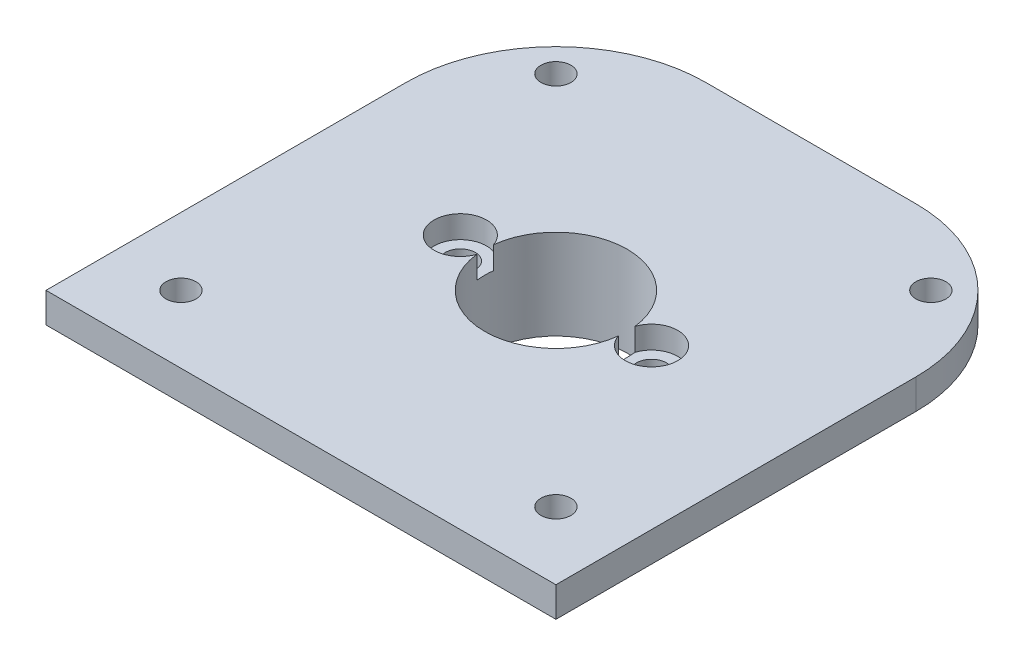
ISO-10303-21;
HEADER;
FILE_DESCRIPTION(('STEP AP214'),'2;1');
FILE_NAME('part.step','',(''),(''),'','','');
FILE_SCHEMA(('AUTOMOTIVE_DESIGN { 1 0 10303 214 1 1 1 1 }'));
ENDSEC;
DATA;
#1=APPLICATION_CONTEXT('core data for automotive mechanical design processes');
#2=APPLICATION_PROTOCOL_DEFINITION('international standard','automotive_design',2000,#1);
#3=PRODUCT_CONTEXT('',#1,'mechanical');
#4=PRODUCT('Part','Part','',(#3));
#5=PRODUCT_RELATED_PRODUCT_CATEGORY('part','',(#4));
#6=PRODUCT_DEFINITION_FORMATION('','',#4);
#7=PRODUCT_DEFINITION_CONTEXT('part definition',#1,'design');
#8=PRODUCT_DEFINITION('design','',#6,#7);
#9=PRODUCT_DEFINITION_SHAPE('','',#8);
#10=(LENGTH_UNIT() NAMED_UNIT(*) SI_UNIT(.MILLI.,.METRE.));
#11=(NAMED_UNIT(*) PLANE_ANGLE_UNIT() SI_UNIT($,.RADIAN.));
#12=(NAMED_UNIT(*) SI_UNIT($,.STERADIAN.) SOLID_ANGLE_UNIT());
#13=UNCERTAINTY_MEASURE_WITH_UNIT(LENGTH_MEASURE(1.E-05),#10,'distance_accuracy_value','');
#14=(GEOMETRIC_REPRESENTATION_CONTEXT(3) GLOBAL_UNCERTAINTY_ASSIGNED_CONTEXT((#13)) GLOBAL_UNIT_ASSIGNED_CONTEXT((#10,
#11,#12)) REPRESENTATION_CONTEXT('',''));
#15=CARTESIAN_POINT('',(0.,0.,0.));
#16=DIRECTION('',(0.,0.,1.));
#17=DIRECTION('',(1.,0.,0.));
#18=AXIS2_PLACEMENT_3D('',#15,#16,#17);
#19=CARTESIAN_POINT('',(21.25,4.,-34.));
#20=DIRECTION('',(0.,-1.,0.));
#21=DIRECTION('',(0.,0.,-1.));
#22=AXIS2_PLACEMENT_3D('',#19,#20,#21);
#23=CYLINDRICAL_SURFACE('',#22,2.);
#24=CARTESIAN_POINT('',(21.25,-8.,-34.));
#25=DIRECTION('',(0.,-1.,0.));
#26=DIRECTION('',(0.,0.,-1.));
#27=AXIS2_PLACEMENT_3D('',#24,#25,#26);
#28=CIRCLE('',#27,2.);
#29=CARTESIAN_POINT('',(21.25,-8.,-36.));
#30=VERTEX_POINT('',#29);
#31=EDGE_CURVE('E498',#30,#30,#28,.T.);
#32=ORIENTED_EDGE('',*,*,#31,.T.);
#33=EDGE_LOOP('',(#32));
#34=FACE_BOUND('',#33,.T.);
#35=CARTESIAN_POINT('',(21.25,1.,-34.));
#36=DIRECTION('',(0.,1.,0.));
#37=DIRECTION('',(0.,0.,1.));
#38=AXIS2_PLACEMENT_3D('',#35,#36,#37);
#39=CIRCLE('',#38,2.);
#40=CARTESIAN_POINT('',(21.25,1.,-32.));
#41=VERTEX_POINT('',#40);
#42=EDGE_CURVE('E481',#41,#41,#39,.T.);
#43=ORIENTED_EDGE('',*,*,#42,.T.);
#44=EDGE_LOOP('',(#43));
#45=FACE_BOUND('',#44,.T.);
#46=ADVANCED_FACE('F39',(#34,#45),#23,.F.);
#47=CARTESIAN_POINT('',(46.75,4.,-34.));
#48=DIRECTION('',(0.,-1.,0.));
#49=DIRECTION('',(0.,0.,-1.));
#50=AXIS2_PLACEMENT_3D('',#47,#48,#49);
#51=CYLINDRICAL_SURFACE('',#50,2.);
#52=CARTESIAN_POINT('',(46.75,-8.,-34.));
#53=DIRECTION('',(0.,-1.,0.));
#54=DIRECTION('',(0.,0.,-1.));
#55=AXIS2_PLACEMENT_3D('',#52,#53,#54);
#56=CIRCLE('',#55,2.);
#57=CARTESIAN_POINT('',(46.75,-8.,-36.));
#58=VERTEX_POINT('',#57);
#59=EDGE_CURVE('E501',#58,#58,#56,.T.);
#60=ORIENTED_EDGE('',*,*,#59,.T.);
#61=EDGE_LOOP('',(#60));
#62=FACE_BOUND('',#61,.T.);
#63=CARTESIAN_POINT('',(46.75,1.,-34.));
#64=DIRECTION('',(0.,1.,0.));
#65=DIRECTION('',(0.,0.,1.));
#66=AXIS2_PLACEMENT_3D('',#63,#64,#65);
#67=CIRCLE('',#66,2.);
#68=CARTESIAN_POINT('',(46.75,1.,-32.));
#69=VERTEX_POINT('',#68);
#70=EDGE_CURVE('E485',#69,#69,#67,.T.);
#71=ORIENTED_EDGE('',*,*,#70,.T.);
#72=EDGE_LOOP('',(#71));
#73=FACE_BOUND('',#72,.T.);
#74=ADVANCED_FACE('F285',(#62,#73),#51,.F.);
#75=CARTESIAN_POINT('',(0.,4.,0.));
#76=DIRECTION('',(0.,-1.,0.));
#77=DIRECTION('',(0.,0.,-1.));
#78=AXIS2_PLACEMENT_3D('',#75,#76,#77);
#79=PLANE('',#78);
#80=DIRECTION('',(0.,0.,-1.));
#81=VECTOR('',#80,1.);
#82=CARTESIAN_POINT('',(68.,4.,0.));
#83=LINE('',#82,#81);
#84=CARTESIAN_POINT('',(68.,4.,0.));
#85=VERTEX_POINT('',#84);
#86=CARTESIAN_POINT('',(68.,4.,-48.));
#87=VERTEX_POINT('',#86);
#88=EDGE_CURVE('E196',#85,#87,#83,.T.);
#89=ORIENTED_EDGE('',*,*,#88,.T.);
#90=CARTESIAN_POINT('',(48.,4.,-48.));
#91=DIRECTION('',(0.,-1.,0.));
#92=DIRECTION('',(0.,0.,-1.));
#93=AXIS2_PLACEMENT_3D('',#90,#91,#92);
#94=CIRCLE('',#93,20.);
#95=CARTESIAN_POINT('',(48.,4.,-68.));
#96=VERTEX_POINT('',#95);
#97=EDGE_CURVE('E48',#87,#96,#94,.F.);
#98=ORIENTED_EDGE('',*,*,#97,.T.);
#99=DIRECTION('',(-1.,0.,0.));
#100=VECTOR('',#99,1.);
#101=CARTESIAN_POINT('',(0.,4.,-68.));
#102=LINE('',#101,#100);
#103=CARTESIAN_POINT('',(20.,4.,-68.));
#104=VERTEX_POINT('',#103);
#105=EDGE_CURVE('E199',#96,#104,#102,.T.);
#106=ORIENTED_EDGE('',*,*,#105,.T.);
#107=CARTESIAN_POINT('',(20.,4.,-48.));
#108=DIRECTION('',(0.,-1.,0.));
#109=DIRECTION('',(0.,0.,-1.));
#110=AXIS2_PLACEMENT_3D('',#107,#108,#109);
#111=CIRCLE('',#110,20.);
#112=CARTESIAN_POINT('',(0.,4.,-48.));
#113=VERTEX_POINT('',#112);
#114=EDGE_CURVE('E55',#104,#113,#111,.F.);
#115=ORIENTED_EDGE('',*,*,#114,.T.);
#116=DIRECTION('',(0.,0.,1.));
#117=VECTOR('',#116,1.);
#118=CARTESIAN_POINT('',(0.,4.,0.));
#119=LINE('',#118,#117);
#120=CARTESIAN_POINT('',(0.,4.,0.));
#121=VERTEX_POINT('',#120);
#122=EDGE_CURVE('E189',#113,#121,#119,.T.);
#123=ORIENTED_EDGE('',*,*,#122,.T.);
#124=DIRECTION('',(1.,0.,0.));
#125=VECTOR('',#124,1.);
#126=CARTESIAN_POINT('',(0.,4.,0.));
#127=LINE('',#126,#125);
#128=EDGE_CURVE('E192',#121,#85,#127,.T.);
#129=ORIENTED_EDGE('',*,*,#128,.T.);
#130=EDGE_LOOP('',(#89,#98,#106,#115,#123,#129));
#131=FACE_BOUND('',#130,.T.);
#132=CARTESIAN_POINT('',(59.,4.,-59.));
#133=DIRECTION('',(0.,1.,0.));
#134=DIRECTION('',(0.,0.,1.));
#135=AXIS2_PLACEMENT_3D('',#132,#133,#134);
#136=CIRCLE('',#135,2.);
#137=CARTESIAN_POINT('',(59.,4.,-57.));
#138=VERTEX_POINT('',#137);
#139=EDGE_CURVE('E181',#138,#138,#136,.T.);
#140=ORIENTED_EDGE('',*,*,#139,.F.);
#141=EDGE_LOOP('',(#140));
#142=FACE_BOUND('',#141,.T.);
#143=CARTESIAN_POINT('',(59.,4.,-9.));
#144=DIRECTION('',(0.,1.,0.));
#145=DIRECTION('',(0.,0.,1.));
#146=AXIS2_PLACEMENT_3D('',#143,#144,#145);
#147=CIRCLE('',#146,2.);
#148=CARTESIAN_POINT('',(59.,4.,-7.));
#149=VERTEX_POINT('',#148);
#150=EDGE_CURVE('E173',#149,#149,#147,.T.);
#151=ORIENTED_EDGE('',*,*,#150,.F.);
#152=EDGE_LOOP('',(#151));
#153=FACE_BOUND('',#152,.T.);
#154=CARTESIAN_POINT('',(8.99999999999999,4.,-9.));
#155=DIRECTION('',(0.,1.,0.));
#156=DIRECTION('',(0.,0.,1.));
#157=AXIS2_PLACEMENT_3D('',#154,#155,#156);
#158=CIRCLE('',#157,2.);
#159=CARTESIAN_POINT('',(8.99999999999999,4.,-7.));
#160=VERTEX_POINT('',#159);
#161=EDGE_CURVE('E165',#160,#160,#158,.T.);
#162=ORIENTED_EDGE('',*,*,#161,.F.);
#163=EDGE_LOOP('',(#162));
#164=FACE_BOUND('',#163,.T.);
#165=CARTESIAN_POINT('',(8.99999999999999,4.,-59.));
#166=DIRECTION('',(0.,1.,0.));
#167=DIRECTION('',(0.,0.,1.));
#168=AXIS2_PLACEMENT_3D('',#165,#166,#167);
#169=CIRCLE('',#168,2.);
#170=CARTESIAN_POINT('',(8.99999999999999,4.,-57.));
#171=VERTEX_POINT('',#170);
#172=EDGE_CURVE('E154',#171,#171,#169,.T.);
#173=ORIENTED_EDGE('',*,*,#172,.F.);
#174=EDGE_LOOP('',(#173));
#175=FACE_BOUND('',#174,.T.);
#176=CARTESIAN_POINT('',(34.,4.,-34.));
#177=DIRECTION('',(0.,1.,0.));
#178=DIRECTION('',(0.,0.,1.));
#179=AXIS2_PLACEMENT_3D('',#176,#177,#178);
#180=CIRCLE('',#179,9.5);
#181=CARTESIAN_POINT('',(24.5661764705882,4.,-32.8806369597324));
#182=VERTEX_POINT('',#181);
#183=CARTESIAN_POINT('',(43.4338235294118,4.,-32.8806369597325));
#184=VERTEX_POINT('',#183);
#185=EDGE_CURVE('E149',#182,#184,#180,.T.);
#186=ORIENTED_EDGE('',*,*,#185,.F.);
#187=CARTESIAN_POINT('',(21.25,4.,-34.));
#188=DIRECTION('',(0.,1.,0.));
#189=DIRECTION('',(0.,0.,1.));
#190=AXIS2_PLACEMENT_3D('',#187,#188,#189);
#191=CIRCLE('',#190,3.5);
#192=CARTESIAN_POINT('',(24.5661764705882,4.,-35.1193630402676));
#193=VERTEX_POINT('',#192);
#194=EDGE_CURVE('E146',#193,#182,#191,.T.);
#195=ORIENTED_EDGE('',*,*,#194,.F.);
#196=CARTESIAN_POINT('',(43.4338235294118,4.,-35.1193630402675));
#197=VERTEX_POINT('',#196);
#198=EDGE_CURVE('E140',#197,#193,#180,.T.);
#199=ORIENTED_EDGE('',*,*,#198,.F.);
#200=CARTESIAN_POINT('',(46.75,4.,-34.));
#201=DIRECTION('',(0.,1.,0.));
#202=DIRECTION('',(0.,0.,1.));
#203=AXIS2_PLACEMENT_3D('',#200,#201,#202);
#204=CIRCLE('',#203,3.5);
#205=EDGE_CURVE('E120',#184,#197,#204,.T.);
#206=ORIENTED_EDGE('',*,*,#205,.F.);
#207=EDGE_LOOP('',(#186,#195,#199,#206));
#208=FACE_BOUND('',#207,.T.);
#209=ADVANCED_FACE('F145',(#131,#142,#153,#164,#175,#208),#79,.F.);
#210=CARTESIAN_POINT('',(0.,0.,0.));
#211=DIRECTION('',(0.,-1.,0.));
#212=DIRECTION('',(0.,0.,-1.));
#213=AXIS2_PLACEMENT_3D('',#210,#211,#212);
#214=PLANE('',#213);
#215=CARTESIAN_POINT('',(34.,0.,-34.));
#216=DIRECTION('',(0.,-1.,0.));
#217=DIRECTION('',(0.,0.,-1.));
#218=AXIS2_PLACEMENT_3D('',#215,#216,#217);
#219=CIRCLE('',#218,19.);
#220=CARTESIAN_POINT('',(34.,0.,-53.));
#221=VERTEX_POINT('',#220);
#222=EDGE_CURVE('E159',#221,#221,#219,.T.);
#223=ORIENTED_EDGE('',*,*,#222,.F.);
#224=EDGE_LOOP('',(#223));
#225=FACE_BOUND('',#224,.T.);
#226=CARTESIAN_POINT('',(8.99999999999999,0.,-59.));
#227=DIRECTION('',(0.,1.,0.));
#228=DIRECTION('',(0.,0.,1.));
#229=AXIS2_PLACEMENT_3D('',#226,#227,#228);
#230=CIRCLE('',#229,2.);
#231=CARTESIAN_POINT('',(8.99999999999999,0.,-57.));
#232=VERTEX_POINT('',#231);
#233=EDGE_CURVE('E148',#232,#232,#230,.T.);
#234=ORIENTED_EDGE('',*,*,#233,.T.);
#235=EDGE_LOOP('',(#234));
#236=FACE_BOUND('',#235,.T.);
#237=CARTESIAN_POINT('',(59.,0.,-9.));
#238=DIRECTION('',(0.,1.,0.));
#239=DIRECTION('',(0.,0.,1.));
#240=AXIS2_PLACEMENT_3D('',#237,#238,#239);
#241=CIRCLE('',#240,2.);
#242=CARTESIAN_POINT('',(59.,0.,-7.));
#243=VERTEX_POINT('',#242);
#244=EDGE_CURVE('E169',#243,#243,#241,.T.);
#245=ORIENTED_EDGE('',*,*,#244,.T.);
#246=EDGE_LOOP('',(#245));
#247=FACE_BOUND('',#246,.T.);
#248=DIRECTION('',(-1.,0.,0.));
#249=VECTOR('',#248,1.);
#250=CARTESIAN_POINT('',(0.,0.,-68.));
#251=LINE('',#250,#249);
#252=CARTESIAN_POINT('',(48.,0.,-68.));
#253=VERTEX_POINT('',#252);
#254=CARTESIAN_POINT('',(20.,0.,-68.));
#255=VERTEX_POINT('',#254);
#256=EDGE_CURVE('E193',#253,#255,#251,.T.);
#257=ORIENTED_EDGE('',*,*,#256,.F.);
#258=CARTESIAN_POINT('',(48.,0.,-48.));
#259=DIRECTION('',(0.,-1.,0.));
#260=DIRECTION('',(0.,0.,-1.));
#261=AXIS2_PLACEMENT_3D('',#258,#259,#260);
#262=CIRCLE('',#261,20.);
#263=CARTESIAN_POINT('',(68.,0.,-48.));
#264=VERTEX_POINT('',#263);
#265=EDGE_CURVE('E246',#253,#264,#262,.T.);
#266=ORIENTED_EDGE('',*,*,#265,.T.);
#267=DIRECTION('',(0.,0.,-1.));
#268=VECTOR('',#267,1.);
#269=CARTESIAN_POINT('',(68.,0.,0.));
#270=LINE('',#269,#268);
#271=CARTESIAN_POINT('',(68.,0.,0.));
#272=VERTEX_POINT('',#271);
#273=EDGE_CURVE('E208',#272,#264,#270,.T.);
#274=ORIENTED_EDGE('',*,*,#273,.F.);
#275=DIRECTION('',(1.,0.,0.));
#276=VECTOR('',#275,1.);
#277=CARTESIAN_POINT('',(0.,0.,0.));
#278=LINE('',#277,#276);
#279=CARTESIAN_POINT('',(0.,0.,0.));
#280=VERTEX_POINT('',#279);
#281=EDGE_CURVE('E205',#280,#272,#278,.T.);
#282=ORIENTED_EDGE('',*,*,#281,.F.);
#283=DIRECTION('',(0.,0.,1.));
#284=VECTOR('',#283,1.);
#285=CARTESIAN_POINT('',(0.,0.,0.));
#286=LINE('',#285,#284);
#287=CARTESIAN_POINT('',(0.,0.,-48.));
#288=VERTEX_POINT('',#287);
#289=EDGE_CURVE('E185',#288,#280,#286,.T.);
#290=ORIENTED_EDGE('',*,*,#289,.F.);
#291=CARTESIAN_POINT('',(20.,0.,-48.));
#292=DIRECTION('',(0.,-1.,0.));
#293=DIRECTION('',(0.,0.,-1.));
#294=AXIS2_PLACEMENT_3D('',#291,#292,#293);
#295=CIRCLE('',#294,20.);
#296=EDGE_CURVE('E243',#288,#255,#295,.T.);
#297=ORIENTED_EDGE('',*,*,#296,.T.);
#298=EDGE_LOOP('',(#257,#266,#274,#282,#290,#297));
#299=FACE_BOUND('',#298,.T.);
#300=CARTESIAN_POINT('',(59.,0.,-59.));
#301=DIRECTION('',(0.,1.,0.));
#302=DIRECTION('',(0.,0.,1.));
#303=AXIS2_PLACEMENT_3D('',#300,#301,#302);
#304=CIRCLE('',#303,2.);
#305=CARTESIAN_POINT('',(59.,0.,-57.));
#306=VERTEX_POINT('',#305);
#307=EDGE_CURVE('E177',#306,#306,#304,.T.);
#308=ORIENTED_EDGE('',*,*,#307,.T.);
#309=EDGE_LOOP('',(#308));
#310=FACE_BOUND('',#309,.T.);
#311=CARTESIAN_POINT('',(8.99999999999999,0.,-9.));
#312=DIRECTION('',(0.,1.,0.));
#313=DIRECTION('',(0.,0.,1.));
#314=AXIS2_PLACEMENT_3D('',#311,#312,#313);
#315=CIRCLE('',#314,2.);
#316=CARTESIAN_POINT('',(8.99999999999999,0.,-7.));
#317=VERTEX_POINT('',#316);
#318=EDGE_CURVE('E163',#317,#317,#315,.T.);
#319=ORIENTED_EDGE('',*,*,#318,.T.);
#320=EDGE_LOOP('',(#319));
#321=FACE_BOUND('',#320,.T.);
#322=ADVANCED_FACE('F265',(#225,#236,#247,#299,#310,#321),#214,.T.);
#323=CARTESIAN_POINT('',(0.,4.,0.));
#324=DIRECTION('',(1.,0.,0.));
#325=DIRECTION('',(0.,0.,-1.));
#326=AXIS2_PLACEMENT_3D('',#323,#324,#325);
#327=PLANE('',#326);
#328=ORIENTED_EDGE('',*,*,#122,.F.);
#329=DIRECTION('',(0.,-1.,0.));
#330=VECTOR('',#329,1.);
#331=CARTESIAN_POINT('',(0.,4.,-48.));
#332=LINE('',#331,#330);
#333=EDGE_CURVE('E11',#113,#288,#332,.T.);
#334=ORIENTED_EDGE('',*,*,#333,.T.);
#335=ORIENTED_EDGE('',*,*,#289,.T.);
#336=DIRECTION('',(0.,-1.,0.));
#337=VECTOR('',#336,1.);
#338=CARTESIAN_POINT('',(0.,4.,0.));
#339=LINE('',#338,#337);
#340=EDGE_CURVE('E217',#121,#280,#339,.T.);
#341=ORIENTED_EDGE('',*,*,#340,.F.);
#342=EDGE_LOOP('',(#328,#334,#335,#341));
#343=FACE_BOUND('',#342,.T.);
#344=ADVANCED_FACE('F276',(#343),#327,.F.);
#345=CARTESIAN_POINT('',(0.,4.,0.));
#346=DIRECTION('',(0.,0.,-1.));
#347=DIRECTION('',(-1.,0.,0.));
#348=AXIS2_PLACEMENT_3D('',#345,#346,#347);
#349=PLANE('',#348);
#350=ORIENTED_EDGE('',*,*,#281,.T.);
#351=DIRECTION('',(0.,-1.,0.));
#352=VECTOR('',#351,1.);
#353=CARTESIAN_POINT('',(68.,4.,0.));
#354=LINE('',#353,#352);
#355=EDGE_CURVE('E202',#85,#272,#354,.T.);
#356=ORIENTED_EDGE('',*,*,#355,.F.);
#357=ORIENTED_EDGE('',*,*,#128,.F.);
#358=ORIENTED_EDGE('',*,*,#340,.T.);
#359=EDGE_LOOP('',(#350,#356,#357,#358));
#360=FACE_BOUND('',#359,.T.);
#361=ADVANCED_FACE('F272',(#360),#349,.F.);
#362=CARTESIAN_POINT('',(68.,4.,0.));
#363=DIRECTION('',(-1.,0.,0.));
#364=DIRECTION('',(0.,0.,1.));
#365=AXIS2_PLACEMENT_3D('',#362,#363,#364);
#366=PLANE('',#365);
#367=ORIENTED_EDGE('',*,*,#273,.T.);
#368=DIRECTION('',(0.,-1.,0.));
#369=VECTOR('',#368,1.);
#370=CARTESIAN_POINT('',(68.,4.,-48.));
#371=LINE('',#370,#369);
#372=EDGE_CURVE('E63',#264,#87,#371,.F.);
#373=ORIENTED_EDGE('',*,*,#372,.T.);
#374=ORIENTED_EDGE('',*,*,#88,.F.);
#375=ORIENTED_EDGE('',*,*,#355,.T.);
#376=EDGE_LOOP('',(#367,#373,#374,#375));
#377=FACE_BOUND('',#376,.T.);
#378=ADVANCED_FACE('F268',(#377),#366,.F.);
#379=CARTESIAN_POINT('',(0.,4.,-68.));
#380=DIRECTION('',(0.,0.,1.));
#381=DIRECTION('',(1.,0.,0.));
#382=AXIS2_PLACEMENT_3D('',#379,#380,#381);
#383=PLANE('',#382);
#384=ORIENTED_EDGE('',*,*,#105,.F.);
#385=DIRECTION('',(0.,-1.,0.));
#386=VECTOR('',#385,1.);
#387=CARTESIAN_POINT('',(48.,4.,-68.));
#388=LINE('',#387,#386);
#389=EDGE_CURVE('E239',#96,#253,#388,.T.);
#390=ORIENTED_EDGE('',*,*,#389,.T.);
#391=ORIENTED_EDGE('',*,*,#256,.T.);
#392=DIRECTION('',(0.,-1.,0.));
#393=VECTOR('',#392,1.);
#394=CARTESIAN_POINT('',(20.,4.,-68.));
#395=LINE('',#394,#393);
#396=EDGE_CURVE('E236',#255,#104,#395,.F.);
#397=ORIENTED_EDGE('',*,*,#396,.T.);
#398=EDGE_LOOP('',(#384,#390,#391,#397));
#399=FACE_BOUND('',#398,.T.);
#400=ADVANCED_FACE('F259',(#399),#383,.F.);
#401=CARTESIAN_POINT('',(59.,4.,-59.));
#402=DIRECTION('',(0.,-1.,0.));
#403=DIRECTION('',(0.,0.,-1.));
#404=AXIS2_PLACEMENT_3D('',#401,#402,#403);
#405=CYLINDRICAL_SURFACE('',#404,2.);
#406=ORIENTED_EDGE('',*,*,#139,.T.);
#407=EDGE_LOOP('',(#406));
#408=FACE_BOUND('',#407,.T.);
#409=ORIENTED_EDGE('',*,*,#307,.F.);
#410=EDGE_LOOP('',(#409));
#411=FACE_BOUND('',#410,.T.);
#412=ADVANCED_FACE('F308',(#408,#411),#405,.F.);
#413=CARTESIAN_POINT('',(59.,4.,-9.));
#414=DIRECTION('',(0.,-1.,0.));
#415=DIRECTION('',(0.,0.,-1.));
#416=AXIS2_PLACEMENT_3D('',#413,#414,#415);
#417=CYLINDRICAL_SURFACE('',#416,2.);
#418=ORIENTED_EDGE('',*,*,#150,.T.);
#419=EDGE_LOOP('',(#418));
#420=FACE_BOUND('',#419,.T.);
#421=ORIENTED_EDGE('',*,*,#244,.F.);
#422=EDGE_LOOP('',(#421));
#423=FACE_BOUND('',#422,.T.);
#424=ADVANCED_FACE('F304',(#420,#423),#417,.F.);
#425=CARTESIAN_POINT('',(8.99999999999999,4.,-9.));
#426=DIRECTION('',(0.,-1.,0.));
#427=DIRECTION('',(0.,0.,-1.));
#428=AXIS2_PLACEMENT_3D('',#425,#426,#427);
#429=CYLINDRICAL_SURFACE('',#428,2.);
#430=ORIENTED_EDGE('',*,*,#161,.T.);
#431=EDGE_LOOP('',(#430));
#432=FACE_BOUND('',#431,.T.);
#433=ORIENTED_EDGE('',*,*,#318,.F.);
#434=EDGE_LOOP('',(#433));
#435=FACE_BOUND('',#434,.T.);
#436=ADVANCED_FACE('F300',(#432,#435),#429,.F.);
#437=CARTESIAN_POINT('',(8.99999999999999,4.,-59.));
#438=DIRECTION('',(0.,-1.,0.));
#439=DIRECTION('',(0.,0.,-1.));
#440=AXIS2_PLACEMENT_3D('',#437,#438,#439);
#441=CYLINDRICAL_SURFACE('',#440,2.);
#442=ORIENTED_EDGE('',*,*,#172,.T.);
#443=EDGE_LOOP('',(#442));
#444=FACE_BOUND('',#443,.T.);
#445=ORIENTED_EDGE('',*,*,#233,.F.);
#446=EDGE_LOOP('',(#445));
#447=FACE_BOUND('',#446,.T.);
#448=ADVANCED_FACE('F297',(#444,#447),#441,.F.);
#449=CARTESIAN_POINT('',(34.,4.,-34.));
#450=DIRECTION('',(0.,-1.,0.));
#451=DIRECTION('',(0.,0.,-1.));
#452=AXIS2_PLACEMENT_3D('',#449,#450,#451);
#453=CYLINDRICAL_SURFACE('',#452,9.5);
#454=DIRECTION('',(0.,1.,0.));
#455=VECTOR('',#454,1.);
#456=CARTESIAN_POINT('',(24.5661764705882,2.5,-35.1193630402676));
#457=LINE('',#456,#455);
#458=CARTESIAN_POINT('',(24.5661764705882,1.,-35.1193630402676));
#459=VERTEX_POINT('',#458);
#460=EDGE_CURVE('E233',#459,#193,#457,.T.);
#461=ORIENTED_EDGE('',*,*,#460,.F.);
#462=CARTESIAN_POINT('',(34.,1.,-34.));
#463=DIRECTION('',(0.,1.,0.));
#464=DIRECTION('',(0.,0.,1.));
#465=AXIS2_PLACEMENT_3D('',#462,#463,#464);
#466=CIRCLE('',#465,9.5);
#467=CARTESIAN_POINT('',(24.5661764705882,1.,-32.8806369597324));
#468=VERTEX_POINT('',#467);
#469=EDGE_CURVE('E225',#459,#468,#466,.T.);
#470=ORIENTED_EDGE('',*,*,#469,.T.);
#471=DIRECTION('',(0.,1.,0.));
#472=VECTOR('',#471,1.);
#473=CARTESIAN_POINT('',(24.5661764705882,2.5,-32.8806369597324));
#474=LINE('',#473,#472);
#475=EDGE_CURVE('E229',#182,#468,#474,.F.);
#476=ORIENTED_EDGE('',*,*,#475,.F.);
#477=ORIENTED_EDGE('',*,*,#185,.T.);
#478=DIRECTION('',(0.,1.,0.));
#479=VECTOR('',#478,1.);
#480=CARTESIAN_POINT('',(43.4338235294118,2.5,-32.8806369597325));
#481=LINE('',#480,#479);
#482=CARTESIAN_POINT('',(43.4338235294118,1.,-32.8806369597325));
#483=VERTEX_POINT('',#482);
#484=EDGE_CURVE('E127',#483,#184,#481,.T.);
#485=ORIENTED_EDGE('',*,*,#484,.F.);
#486=CARTESIAN_POINT('',(34.,1.,-34.));
#487=DIRECTION('',(0.,1.,0.));
#488=DIRECTION('',(0.,0.,1.));
#489=AXIS2_PLACEMENT_3D('',#486,#487,#488);
#490=CIRCLE('',#489,9.5);
#491=CARTESIAN_POINT('',(43.4338235294118,1.,-35.1193630402675));
#492=VERTEX_POINT('',#491);
#493=EDGE_CURVE('E141',#483,#492,#490,.T.);
#494=ORIENTED_EDGE('',*,*,#493,.T.);
#495=DIRECTION('',(0.,1.,0.));
#496=VECTOR('',#495,1.);
#497=CARTESIAN_POINT('',(43.4338235294118,2.5,-35.1193630402675));
#498=LINE('',#497,#496);
#499=EDGE_CURVE('E124',#197,#492,#498,.F.);
#500=ORIENTED_EDGE('',*,*,#499,.F.);
#501=ORIENTED_EDGE('',*,*,#198,.T.);
#502=EDGE_LOOP('',(#461,#470,#476,#477,#485,#494,#500,#501));
#503=FACE_BOUND('',#502,.T.);
#504=CARTESIAN_POINT('',(34.,-8.,-34.));
#505=DIRECTION('',(0.,-1.,0.));
#506=DIRECTION('',(0.,0.,-1.));
#507=AXIS2_PLACEMENT_3D('',#504,#505,#506);
#508=CIRCLE('',#507,9.5);
#509=CARTESIAN_POINT('',(34.,-8.,-43.5));
#510=VERTEX_POINT('',#509);
#511=EDGE_CURVE('E505',#510,#510,#508,.T.);
#512=ORIENTED_EDGE('',*,*,#511,.T.);
#513=EDGE_LOOP('',(#512));
#514=FACE_BOUND('',#513,.T.);
#515=ADVANCED_FACE('F138',(#503,#514),#453,.F.);
#516=CARTESIAN_POINT('',(34.,-8.,-34.));
#517=DIRECTION('',(0.,-1.,0.));
#518=DIRECTION('',(0.,0.,-1.));
#519=AXIS2_PLACEMENT_3D('',#516,#517,#518);
#520=PLANE('',#519);
#521=ORIENTED_EDGE('',*,*,#59,.F.);
#522=EDGE_LOOP('',(#521));
#523=FACE_BOUND('',#522,.T.);
#524=CARTESIAN_POINT('',(34.,-8.,-34.));
#525=DIRECTION('',(0.,-1.,0.));
#526=DIRECTION('',(0.,0.,-1.));
#527=AXIS2_PLACEMENT_3D('',#524,#525,#526);
#528=CIRCLE('',#527,19.);
#529=CARTESIAN_POINT('',(34.,-8.,-53.));
#530=VERTEX_POINT('',#529);
#531=EDGE_CURVE('E156',#530,#530,#528,.T.);
#532=ORIENTED_EDGE('',*,*,#531,.T.);
#533=EDGE_LOOP('',(#532));
#534=FACE_BOUND('',#533,.T.);
#535=ORIENTED_EDGE('',*,*,#511,.F.);
#536=EDGE_LOOP('',(#535));
#537=FACE_BOUND('',#536,.T.);
#538=ORIENTED_EDGE('',*,*,#31,.F.);
#539=EDGE_LOOP('',(#538));
#540=FACE_BOUND('',#539,.T.);
#541=ADVANCED_FACE('F365',(#523,#534,#537,#540),#520,.T.);
#542=CARTESIAN_POINT('',(34.,-8.,-34.));
#543=DIRECTION('',(0.,1.,0.));
#544=DIRECTION('',(0.,0.,1.));
#545=AXIS2_PLACEMENT_3D('',#542,#543,#544);
#546=CYLINDRICAL_SURFACE('',#545,19.);
#547=ORIENTED_EDGE('',*,*,#531,.F.);
#548=EDGE_LOOP('',(#547));
#549=FACE_BOUND('',#548,.T.);
#550=ORIENTED_EDGE('',*,*,#222,.T.);
#551=EDGE_LOOP('',(#550));
#552=FACE_BOUND('',#551,.T.);
#553=ADVANCED_FACE('F372',(#549,#552),#546,.T.);
#554=CARTESIAN_POINT('',(46.75,1.,-34.));
#555=DIRECTION('',(0.,1.,0.));
#556=DIRECTION('',(0.,0.,1.));
#557=AXIS2_PLACEMENT_3D('',#554,#555,#556);
#558=CYLINDRICAL_SURFACE('',#557,3.5);
#559=ORIENTED_EDGE('',*,*,#484,.T.);
#560=ORIENTED_EDGE('',*,*,#205,.T.);
#561=ORIENTED_EDGE('',*,*,#499,.T.);
#562=CARTESIAN_POINT('',(46.75,1.,-34.));
#563=DIRECTION('',(0.,1.,0.));
#564=DIRECTION('',(0.,0.,1.));
#565=AXIS2_PLACEMENT_3D('',#562,#563,#564);
#566=CIRCLE('',#565,3.5);
#567=EDGE_CURVE('E133',#483,#492,#566,.T.);
#568=ORIENTED_EDGE('',*,*,#567,.F.);
#569=EDGE_LOOP('',(#559,#560,#561,#568));
#570=FACE_BOUND('',#569,.T.);
#571=ADVANCED_FACE('F122',(#570),#558,.F.);
#572=CARTESIAN_POINT('',(46.75,1.,-34.));
#573=DIRECTION('',(0.,1.,0.));
#574=DIRECTION('',(0.,0.,1.));
#575=AXIS2_PLACEMENT_3D('',#572,#573,#574);
#576=PLANE('',#575);
#577=ORIENTED_EDGE('',*,*,#70,.F.);
#578=EDGE_LOOP('',(#577));
#579=FACE_BOUND('',#578,.T.);
#580=ORIENTED_EDGE('',*,*,#567,.T.);
#581=ORIENTED_EDGE('',*,*,#493,.F.);
#582=EDGE_LOOP('',(#580,#581));
#583=FACE_BOUND('',#582,.T.);
#584=ADVANCED_FACE('F386',(#579,#583),#576,.T.);
#585=CARTESIAN_POINT('',(21.25,1.,-34.));
#586=DIRECTION('',(0.,1.,0.));
#587=DIRECTION('',(0.,0.,1.));
#588=AXIS2_PLACEMENT_3D('',#585,#586,#587);
#589=CYLINDRICAL_SURFACE('',#588,3.5);
#590=ORIENTED_EDGE('',*,*,#460,.T.);
#591=ORIENTED_EDGE('',*,*,#194,.T.);
#592=ORIENTED_EDGE('',*,*,#475,.T.);
#593=CARTESIAN_POINT('',(21.25,1.,-34.));
#594=DIRECTION('',(0.,1.,0.));
#595=DIRECTION('',(0.,0.,1.));
#596=AXIS2_PLACEMENT_3D('',#593,#594,#595);
#597=CIRCLE('',#596,3.5);
#598=EDGE_CURVE('E483',#459,#468,#597,.T.);
#599=ORIENTED_EDGE('',*,*,#598,.F.);
#600=EDGE_LOOP('',(#590,#591,#592,#599));
#601=FACE_BOUND('',#600,.T.);
#602=ADVANCED_FACE('F393',(#601),#589,.F.);
#603=CARTESIAN_POINT('',(21.25,1.,-34.));
#604=DIRECTION('',(0.,1.,0.));
#605=DIRECTION('',(0.,0.,1.));
#606=AXIS2_PLACEMENT_3D('',#603,#604,#605);
#607=PLANE('',#606);
#608=ORIENTED_EDGE('',*,*,#42,.F.);
#609=EDGE_LOOP('',(#608));
#610=FACE_BOUND('',#609,.T.);
#611=ORIENTED_EDGE('',*,*,#598,.T.);
#612=ORIENTED_EDGE('',*,*,#469,.F.);
#613=EDGE_LOOP('',(#611,#612));
#614=FACE_BOUND('',#613,.T.);
#615=ADVANCED_FACE('F283',(#610,#614),#607,.T.);
#616=CARTESIAN_POINT('',(48.,4.,-48.));
#617=DIRECTION('',(0.,-1.,0.));
#618=DIRECTION('',(0.,0.,-1.));
#619=AXIS2_PLACEMENT_3D('',#616,#617,#618);
#620=CYLINDRICAL_SURFACE('',#619,20.);
#621=ORIENTED_EDGE('',*,*,#97,.F.);
#622=ORIENTED_EDGE('',*,*,#372,.F.);
#623=ORIENTED_EDGE('',*,*,#265,.F.);
#624=ORIENTED_EDGE('',*,*,#389,.F.);
#625=EDGE_LOOP('',(#621,#622,#623,#624));
#626=FACE_BOUND('',#625,.T.);
#627=ADVANCED_FACE('F262',(#626),#620,.T.);
#628=CARTESIAN_POINT('',(20.,4.,-48.));
#629=DIRECTION('',(0.,-1.,0.));
#630=DIRECTION('',(0.,0.,-1.));
#631=AXIS2_PLACEMENT_3D('',#628,#629,#630);
#632=CYLINDRICAL_SURFACE('',#631,20.);
#633=ORIENTED_EDGE('',*,*,#114,.F.);
#634=ORIENTED_EDGE('',*,*,#396,.F.);
#635=ORIENTED_EDGE('',*,*,#296,.F.);
#636=ORIENTED_EDGE('',*,*,#333,.F.);
#637=EDGE_LOOP('',(#633,#634,#635,#636));
#638=FACE_BOUND('',#637,.T.);
#639=ADVANCED_FACE('F41',(#638),#632,.T.);
#640=CLOSED_SHELL('',(#46,#74,#209,#322,#344,#361,#378,#400,#412,#424,#436,#448,#515,#541,#553,
#571,#584,#602,#615,#627,#639));
#641=MANIFOLD_SOLID_BREP('B2',#640);
#642=ADVANCED_BREP_SHAPE_REPRESENTATION('',(#18,#641),#14);
#643=SHAPE_DEFINITION_REPRESENTATION(#9,#642);
ENDSEC;
END-ISO-10303-21;
